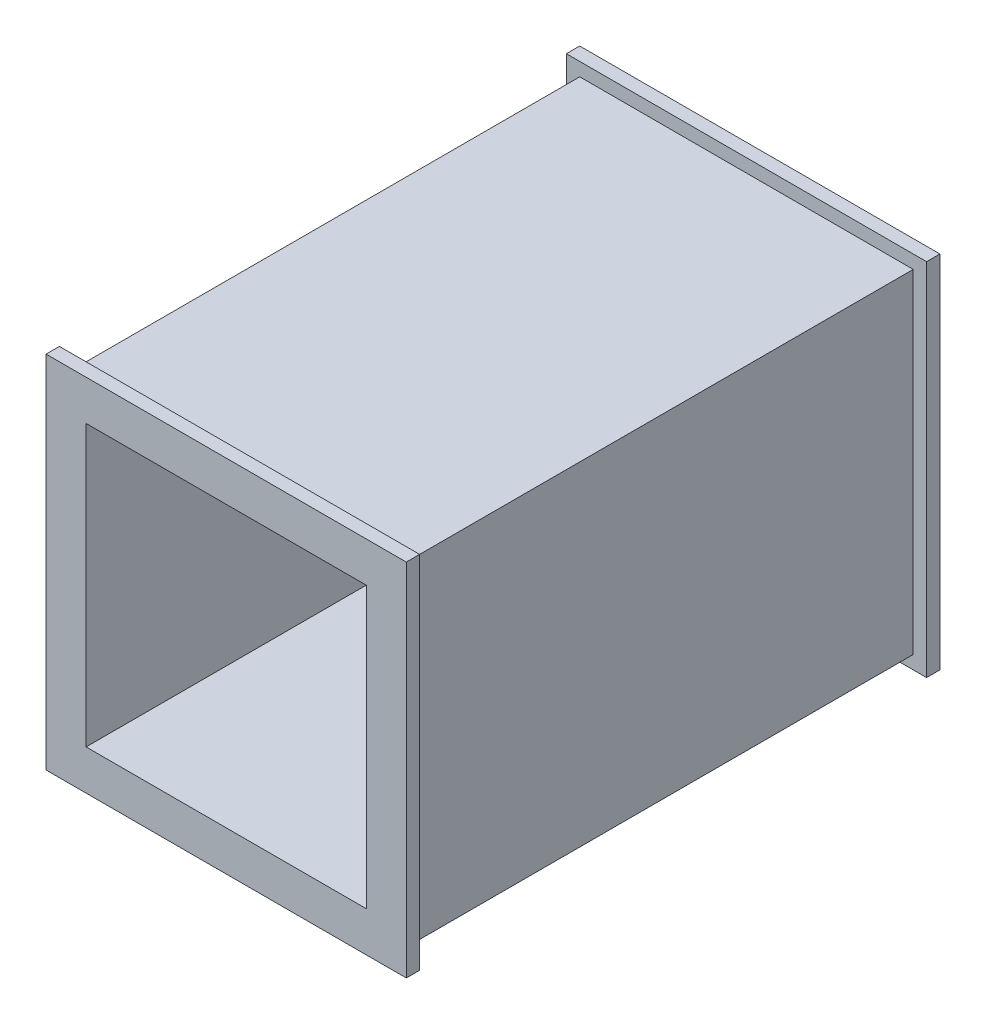
ISO-10303-21;
HEADER;
FILE_DESCRIPTION(('STEP AP214'),'2;1');
FILE_NAME('part.step','',(''),(''),'','','');
FILE_SCHEMA(('AUTOMOTIVE_DESIGN { 1 0 10303 214 1 1 1 1 }'));
ENDSEC;
DATA;
#1=APPLICATION_CONTEXT('core data for automotive mechanical design processes');
#2=APPLICATION_PROTOCOL_DEFINITION('international standard','automotive_design',2000,#1);
#3=PRODUCT_CONTEXT('',#1,'mechanical');
#4=PRODUCT('Part','Part','',(#3));
#5=PRODUCT_RELATED_PRODUCT_CATEGORY('part','',(#4));
#6=PRODUCT_DEFINITION_FORMATION('','',#4);
#7=PRODUCT_DEFINITION_CONTEXT('part definition',#1,'design');
#8=PRODUCT_DEFINITION('design','',#6,#7);
#9=PRODUCT_DEFINITION_SHAPE('','',#8);
#10=(LENGTH_UNIT() NAMED_UNIT(*) SI_UNIT(.MILLI.,.METRE.));
#11=(NAMED_UNIT(*) PLANE_ANGLE_UNIT() SI_UNIT($,.RADIAN.));
#12=(NAMED_UNIT(*) SI_UNIT($,.STERADIAN.) SOLID_ANGLE_UNIT());
#13=UNCERTAINTY_MEASURE_WITH_UNIT(LENGTH_MEASURE(1.E-05),#10,'distance_accuracy_value','');
#14=(GEOMETRIC_REPRESENTATION_CONTEXT(3) GLOBAL_UNCERTAINTY_ASSIGNED_CONTEXT((#13)) GLOBAL_UNIT_ASSIGNED_CONTEXT((#10,
#11,#12)) REPRESENTATION_CONTEXT('',''));
#15=CARTESIAN_POINT('',(0.,0.,0.));
#16=DIRECTION('',(0.,0.,1.));
#17=DIRECTION('',(1.,0.,0.));
#18=AXIS2_PLACEMENT_3D('',#15,#16,#17);
#19=CARTESIAN_POINT('',(62.5,62.5,200.));
#20=DIRECTION('',(-1.,0.,0.));
#21=DIRECTION('',(0.,-1.,0.));
#22=AXIS2_PLACEMENT_3D('',#19,#20,#21);
#23=PLANE('',#22);
#24=DIRECTION('',(0.,-1.,0.));
#25=VECTOR('',#24,1.);
#26=CARTESIAN_POINT('',(62.5,62.5,5.));
#27=LINE('',#26,#25);
#28=CARTESIAN_POINT('',(62.5,62.5,5.));
#29=VERTEX_POINT('',#28);
#30=CARTESIAN_POINT('',(62.5,-62.5,5.));
#31=VERTEX_POINT('',#30);
#32=EDGE_CURVE('E55',#29,#31,#27,.T.);
#33=ORIENTED_EDGE('',*,*,#32,.F.);
#34=DIRECTION('',(0.,0.,-1.));
#35=VECTOR('',#34,1.);
#36=CARTESIAN_POINT('',(62.5,62.5,200.));
#37=LINE('',#36,#35);
#38=CARTESIAN_POINT('',(62.5,62.5,195.));
#39=VERTEX_POINT('',#38);
#40=EDGE_CURVE('E11',#39,#29,#37,.T.);
#41=ORIENTED_EDGE('',*,*,#40,.F.);
#42=DIRECTION('',(0.,1.,0.));
#43=VECTOR('',#42,1.);
#44=CARTESIAN_POINT('',(62.5,62.5,195.));
#45=LINE('',#44,#43);
#46=CARTESIAN_POINT('',(62.5,-62.5,195.));
#47=VERTEX_POINT('',#46);
#48=EDGE_CURVE('E247',#47,#39,#45,.T.);
#49=ORIENTED_EDGE('',*,*,#48,.F.);
#50=DIRECTION('',(0.,0.,-1.));
#51=VECTOR('',#50,1.);
#52=CARTESIAN_POINT('',(62.5,-62.5,200.));
#53=LINE('',#52,#51);
#54=EDGE_CURVE('E253',#47,#31,#53,.T.);
#55=ORIENTED_EDGE('',*,*,#54,.T.);
#56=EDGE_LOOP('',(#33,#41,#49,#55));
#57=FACE_BOUND('',#56,.T.);
#58=ADVANCED_FACE('F41',(#57),#23,.F.);
#59=CARTESIAN_POINT('',(-62.5,62.5,200.));
#60=DIRECTION('',(0.,-1.,0.));
#61=DIRECTION('',(0.,0.,-1.));
#62=AXIS2_PLACEMENT_3D('',#59,#60,#61);
#63=PLANE('',#62);
#64=DIRECTION('',(1.,0.,0.));
#65=VECTOR('',#64,1.);
#66=CARTESIAN_POINT('',(-62.5,62.5,5.));
#67=LINE('',#66,#65);
#68=CARTESIAN_POINT('',(-62.5,62.5,5.));
#69=VERTEX_POINT('',#68);
#70=EDGE_CURVE('E61',#69,#29,#67,.T.);
#71=ORIENTED_EDGE('',*,*,#70,.F.);
#72=DIRECTION('',(0.,0.,-1.));
#73=VECTOR('',#72,1.);
#74=CARTESIAN_POINT('',(-62.5,62.5,200.));
#75=LINE('',#74,#73);
#76=CARTESIAN_POINT('',(-62.5,62.5,195.));
#77=VERTEX_POINT('',#76);
#78=EDGE_CURVE('E48',#77,#69,#75,.T.);
#79=ORIENTED_EDGE('',*,*,#78,.F.);
#80=DIRECTION('',(-1.,0.,0.));
#81=VECTOR('',#80,1.);
#82=CARTESIAN_POINT('',(-62.5,62.5,195.));
#83=LINE('',#82,#81);
#84=EDGE_CURVE('E244',#39,#77,#83,.T.);
#85=ORIENTED_EDGE('',*,*,#84,.F.);
#86=ORIENTED_EDGE('',*,*,#40,.T.);
#87=EDGE_LOOP('',(#71,#79,#85,#86));
#88=FACE_BOUND('',#87,.T.);
#89=ADVANCED_FACE('F291',(#88),#63,.F.);
#90=CARTESIAN_POINT('',(-62.5,62.5,200.));
#91=DIRECTION('',(1.,0.,0.));
#92=DIRECTION('',(0.,1.,0.));
#93=AXIS2_PLACEMENT_3D('',#90,#91,#92);
#94=PLANE('',#93);
#95=DIRECTION('',(0.,1.,0.));
#96=VECTOR('',#95,1.);
#97=CARTESIAN_POINT('',(-62.5,62.5,5.));
#98=LINE('',#97,#96);
#99=CARTESIAN_POINT('',(-62.5,-62.5,5.));
#100=VERTEX_POINT('',#99);
#101=EDGE_CURVE('E201',#100,#69,#98,.T.);
#102=ORIENTED_EDGE('',*,*,#101,.F.);
#103=DIRECTION('',(0.,0.,-1.));
#104=VECTOR('',#103,1.);
#105=CARTESIAN_POINT('',(-62.5,-62.5,200.));
#106=LINE('',#105,#104);
#107=CARTESIAN_POINT('',(-62.5,-62.5,195.));
#108=VERTEX_POINT('',#107);
#109=EDGE_CURVE('E281',#108,#100,#106,.T.);
#110=ORIENTED_EDGE('',*,*,#109,.F.);
#111=DIRECTION('',(0.,-1.,0.));
#112=VECTOR('',#111,1.);
#113=CARTESIAN_POINT('',(-62.5,62.5,195.));
#114=LINE('',#113,#112);
#115=EDGE_CURVE('E241',#77,#108,#114,.T.);
#116=ORIENTED_EDGE('',*,*,#115,.F.);
#117=ORIENTED_EDGE('',*,*,#78,.T.);
#118=EDGE_LOOP('',(#102,#110,#116,#117));
#119=FACE_BOUND('',#118,.T.);
#120=ADVANCED_FACE('F284',(#119),#94,.F.);
#121=CARTESIAN_POINT('',(-62.5,-62.5,200.));
#122=DIRECTION('',(0.,1.,0.));
#123=DIRECTION('',(0.,0.,1.));
#124=AXIS2_PLACEMENT_3D('',#121,#122,#123);
#125=PLANE('',#124);
#126=DIRECTION('',(-1.,0.,0.));
#127=VECTOR('',#126,1.);
#128=CARTESIAN_POINT('',(-62.5,-62.5,5.));
#129=LINE('',#128,#127);
#130=EDGE_CURVE('E195',#31,#100,#129,.T.);
#131=ORIENTED_EDGE('',*,*,#130,.F.);
#132=ORIENTED_EDGE('',*,*,#54,.F.);
#133=DIRECTION('',(1.,0.,0.));
#134=VECTOR('',#133,1.);
#135=CARTESIAN_POINT('',(-62.5,-62.5,195.));
#136=LINE('',#135,#134);
#137=EDGE_CURVE('E233',#108,#47,#136,.T.);
#138=ORIENTED_EDGE('',*,*,#137,.F.);
#139=ORIENTED_EDGE('',*,*,#109,.T.);
#140=EDGE_LOOP('',(#131,#132,#138,#139));
#141=FACE_BOUND('',#140,.T.);
#142=ADVANCED_FACE('F287',(#141),#125,.F.);
#143=CARTESIAN_POINT('',(0.,0.,200.));
#144=DIRECTION('',(0.,0.,1.));
#145=DIRECTION('',(1.,0.,0.));
#146=AXIS2_PLACEMENT_3D('',#143,#144,#145);
#147=PLANE('',#146);
#148=DIRECTION('',(0.,1.,0.));
#149=VECTOR('',#148,1.);
#150=CARTESIAN_POINT('',(52.5,62.5,200.));
#151=LINE('',#150,#149);
#152=CARTESIAN_POINT('',(52.5,-52.5,200.));
#153=VERTEX_POINT('',#152);
#154=CARTESIAN_POINT('',(52.5,52.5,200.));
#155=VERTEX_POINT('',#154);
#156=EDGE_CURVE('E267',#153,#155,#151,.T.);
#157=ORIENTED_EDGE('',*,*,#156,.F.);
#158=DIRECTION('',(1.,0.,0.));
#159=VECTOR('',#158,1.);
#160=CARTESIAN_POINT('',(-62.5,-52.5,200.));
#161=LINE('',#160,#159);
#162=CARTESIAN_POINT('',(-52.5,-52.5,200.));
#163=VERTEX_POINT('',#162);
#164=EDGE_CURVE('E258',#163,#153,#161,.T.);
#165=ORIENTED_EDGE('',*,*,#164,.F.);
#166=DIRECTION('',(0.,-1.,0.));
#167=VECTOR('',#166,1.);
#168=CARTESIAN_POINT('',(-52.5,62.5,200.));
#169=LINE('',#168,#167);
#170=CARTESIAN_POINT('',(-52.5,52.5,200.));
#171=VERTEX_POINT('',#170);
#172=EDGE_CURVE('E276',#171,#163,#169,.T.);
#173=ORIENTED_EDGE('',*,*,#172,.F.);
#174=DIRECTION('',(-1.,0.,0.));
#175=VECTOR('',#174,1.);
#176=CARTESIAN_POINT('',(-62.5,52.5,200.));
#177=LINE('',#176,#175);
#178=EDGE_CURVE('E274',#155,#171,#177,.T.);
#179=ORIENTED_EDGE('',*,*,#178,.F.);
#180=EDGE_LOOP('',(#157,#165,#173,#179));
#181=FACE_BOUND('',#180,.T.);
#182=DIRECTION('',(1.,0.,0.));
#183=VECTOR('',#182,1.);
#184=CARTESIAN_POINT('',(0.,-67.5,200.));
#185=LINE('',#184,#183);
#186=CARTESIAN_POINT('',(-67.5,-67.5,200.));
#187=VERTEX_POINT('',#186);
#188=CARTESIAN_POINT('',(67.5,-67.5,200.));
#189=VERTEX_POINT('',#188);
#190=EDGE_CURVE('E206',#187,#189,#185,.T.);
#191=ORIENTED_EDGE('',*,*,#190,.T.);
#192=DIRECTION('',(0.,1.,0.));
#193=VECTOR('',#192,1.);
#194=CARTESIAN_POINT('',(67.5,0.,200.));
#195=LINE('',#194,#193);
#196=CARTESIAN_POINT('',(67.5,67.5,200.));
#197=VERTEX_POINT('',#196);
#198=EDGE_CURVE('E223',#189,#197,#195,.T.);
#199=ORIENTED_EDGE('',*,*,#198,.T.);
#200=DIRECTION('',(-1.,0.,0.));
#201=VECTOR('',#200,1.);
#202=CARTESIAN_POINT('',(0.,67.5,200.));
#203=LINE('',#202,#201);
#204=CARTESIAN_POINT('',(-67.5,67.5,200.));
#205=VERTEX_POINT('',#204);
#206=EDGE_CURVE('E226',#197,#205,#203,.T.);
#207=ORIENTED_EDGE('',*,*,#206,.T.);
#208=DIRECTION('',(0.,-1.,0.));
#209=VECTOR('',#208,1.);
#210=CARTESIAN_POINT('',(-67.5,0.,200.));
#211=LINE('',#210,#209);
#212=EDGE_CURVE('E211',#205,#187,#211,.T.);
#213=ORIENTED_EDGE('',*,*,#212,.T.);
#214=EDGE_LOOP('',(#191,#199,#207,#213));
#215=FACE_BOUND('',#214,.T.);
#216=ADVANCED_FACE('F301',(#181,#215),#147,.T.);
#217=CARTESIAN_POINT('',(0.,0.,0.));
#218=DIRECTION('',(0.,0.,1.));
#219=DIRECTION('',(1.,0.,0.));
#220=AXIS2_PLACEMENT_3D('',#217,#218,#219);
#221=PLANE('',#220);
#222=DIRECTION('',(1.,0.,0.));
#223=VECTOR('',#222,1.);
#224=CARTESIAN_POINT('',(-62.5,-52.5,0.));
#225=LINE('',#224,#223);
#226=CARTESIAN_POINT('',(-52.5,-52.5,0.));
#227=VERTEX_POINT('',#226);
#228=CARTESIAN_POINT('',(52.5,-52.5,0.));
#229=VERTEX_POINT('',#228);
#230=EDGE_CURVE('E264',#227,#229,#225,.T.);
#231=ORIENTED_EDGE('',*,*,#230,.T.);
#232=DIRECTION('',(0.,1.,0.));
#233=VECTOR('',#232,1.);
#234=CARTESIAN_POINT('',(52.5,62.5,0.));
#235=LINE('',#234,#233);
#236=CARTESIAN_POINT('',(52.5,52.5,0.));
#237=VERTEX_POINT('',#236);
#238=EDGE_CURVE('E250',#229,#237,#235,.T.);
#239=ORIENTED_EDGE('',*,*,#238,.T.);
#240=DIRECTION('',(-1.,0.,0.));
#241=VECTOR('',#240,1.);
#242=CARTESIAN_POINT('',(-62.5,52.5,0.));
#243=LINE('',#242,#241);
#244=CARTESIAN_POINT('',(-52.5,52.5,0.));
#245=VERTEX_POINT('',#244);
#246=EDGE_CURVE('E263',#237,#245,#243,.T.);
#247=ORIENTED_EDGE('',*,*,#246,.T.);
#248=DIRECTION('',(0.,-1.,0.));
#249=VECTOR('',#248,1.);
#250=CARTESIAN_POINT('',(-52.5,62.5,0.));
#251=LINE('',#250,#249);
#252=EDGE_CURVE('E268',#245,#227,#251,.T.);
#253=ORIENTED_EDGE('',*,*,#252,.T.);
#254=EDGE_LOOP('',(#231,#239,#247,#253));
#255=FACE_BOUND('',#254,.T.);
#256=DIRECTION('',(-1.,0.,0.));
#257=VECTOR('',#256,1.);
#258=CARTESIAN_POINT('',(0.,-67.5,0.));
#259=LINE('',#258,#257);
#260=CARTESIAN_POINT('',(67.5,-67.5,0.));
#261=VERTEX_POINT('',#260);
#262=CARTESIAN_POINT('',(-67.5,-67.5,0.));
#263=VERTEX_POINT('',#262);
#264=EDGE_CURVE('E189',#261,#263,#259,.T.);
#265=ORIENTED_EDGE('',*,*,#264,.T.);
#266=DIRECTION('',(0.,1.,0.));
#267=VECTOR('',#266,1.);
#268=CARTESIAN_POINT('',(-67.5,0.,0.));
#269=LINE('',#268,#267);
#270=CARTESIAN_POINT('',(-67.5,67.5,0.));
#271=VERTEX_POINT('',#270);
#272=EDGE_CURVE('E160',#263,#271,#269,.T.);
#273=ORIENTED_EDGE('',*,*,#272,.T.);
#274=DIRECTION('',(1.,0.,0.));
#275=VECTOR('',#274,1.);
#276=CARTESIAN_POINT('',(0.,67.5,0.));
#277=LINE('',#276,#275);
#278=CARTESIAN_POINT('',(67.5,67.5,0.));
#279=VERTEX_POINT('',#278);
#280=EDGE_CURVE('E184',#271,#279,#277,.T.);
#281=ORIENTED_EDGE('',*,*,#280,.T.);
#282=DIRECTION('',(0.,-1.,0.));
#283=VECTOR('',#282,1.);
#284=CARTESIAN_POINT('',(67.5,0.,0.));
#285=LINE('',#284,#283);
#286=EDGE_CURVE('E181',#279,#261,#285,.T.);
#287=ORIENTED_EDGE('',*,*,#286,.T.);
#288=EDGE_LOOP('',(#265,#273,#281,#287));
#289=FACE_BOUND('',#288,.T.);
#290=ADVANCED_FACE('F302',(#255,#289),#221,.F.);
#291=CARTESIAN_POINT('',(52.5,62.5,200.));
#292=DIRECTION('',(-1.,0.,0.));
#293=DIRECTION('',(0.,-1.,0.));
#294=AXIS2_PLACEMENT_3D('',#291,#292,#293);
#295=PLANE('',#294);
#296=ORIENTED_EDGE('',*,*,#238,.F.);
#297=DIRECTION('',(0.,0.,-1.));
#298=VECTOR('',#297,1.);
#299=CARTESIAN_POINT('',(52.5,-52.5,200.));
#300=LINE('',#299,#298);
#301=EDGE_CURVE('E255',#153,#229,#300,.T.);
#302=ORIENTED_EDGE('',*,*,#301,.F.);
#303=ORIENTED_EDGE('',*,*,#156,.T.);
#304=DIRECTION('',(0.,0.,-1.));
#305=VECTOR('',#304,1.);
#306=CARTESIAN_POINT('',(52.5,52.5,200.));
#307=LINE('',#306,#305);
#308=EDGE_CURVE('E251',#155,#237,#307,.T.);
#309=ORIENTED_EDGE('',*,*,#308,.T.);
#310=EDGE_LOOP('',(#296,#302,#303,#309));
#311=FACE_BOUND('',#310,.T.);
#312=ADVANCED_FACE('F305',(#311),#295,.T.);
#313=CARTESIAN_POINT('',(-62.5,52.5,200.));
#314=DIRECTION('',(0.,-1.,0.));
#315=DIRECTION('',(0.,0.,-1.));
#316=AXIS2_PLACEMENT_3D('',#313,#314,#315);
#317=PLANE('',#316);
#318=ORIENTED_EDGE('',*,*,#246,.F.);
#319=ORIENTED_EDGE('',*,*,#308,.F.);
#320=ORIENTED_EDGE('',*,*,#178,.T.);
#321=DIRECTION('',(0.,0.,-1.));
#322=VECTOR('',#321,1.);
#323=CARTESIAN_POINT('',(-52.5,52.5,200.));
#324=LINE('',#323,#322);
#325=EDGE_CURVE('E254',#171,#245,#324,.T.);
#326=ORIENTED_EDGE('',*,*,#325,.T.);
#327=EDGE_LOOP('',(#318,#319,#320,#326));
#328=FACE_BOUND('',#327,.T.);
#329=ADVANCED_FACE('F317',(#328),#317,.T.);
#330=CARTESIAN_POINT('',(-52.5,62.5,200.));
#331=DIRECTION('',(1.,0.,0.));
#332=DIRECTION('',(0.,1.,0.));
#333=AXIS2_PLACEMENT_3D('',#330,#331,#332);
#334=PLANE('',#333);
#335=ORIENTED_EDGE('',*,*,#252,.F.);
#336=ORIENTED_EDGE('',*,*,#325,.F.);
#337=ORIENTED_EDGE('',*,*,#172,.T.);
#338=DIRECTION('',(0.,0.,-1.));
#339=VECTOR('',#338,1.);
#340=CARTESIAN_POINT('',(-52.5,-52.5,200.));
#341=LINE('',#340,#339);
#342=EDGE_CURVE('E257',#163,#227,#341,.T.);
#343=ORIENTED_EDGE('',*,*,#342,.T.);
#344=EDGE_LOOP('',(#335,#336,#337,#343));
#345=FACE_BOUND('',#344,.T.);
#346=ADVANCED_FACE('F313',(#345),#334,.T.);
#347=CARTESIAN_POINT('',(-62.5,-52.5,200.));
#348=DIRECTION('',(0.,1.,0.));
#349=DIRECTION('',(0.,0.,1.));
#350=AXIS2_PLACEMENT_3D('',#347,#348,#349);
#351=PLANE('',#350);
#352=ORIENTED_EDGE('',*,*,#230,.F.);
#353=ORIENTED_EDGE('',*,*,#342,.F.);
#354=ORIENTED_EDGE('',*,*,#164,.T.);
#355=ORIENTED_EDGE('',*,*,#301,.T.);
#356=EDGE_LOOP('',(#352,#353,#354,#355));
#357=FACE_BOUND('',#356,.T.);
#358=ADVANCED_FACE('F310',(#357),#351,.T.);
#359=CARTESIAN_POINT('',(0.,0.,195.));
#360=DIRECTION('',(0.,0.,1.));
#361=DIRECTION('',(1.,0.,0.));
#362=AXIS2_PLACEMENT_3D('',#359,#360,#361);
#363=PLANE('',#362);
#364=DIRECTION('',(1.,0.,0.));
#365=VECTOR('',#364,1.);
#366=CARTESIAN_POINT('',(0.,-67.5,195.));
#367=LINE('',#366,#365);
#368=CARTESIAN_POINT('',(-67.5,-67.5,195.));
#369=VERTEX_POINT('',#368);
#370=CARTESIAN_POINT('',(67.5,-67.5,195.));
#371=VERTEX_POINT('',#370);
#372=EDGE_CURVE('E207',#369,#371,#367,.T.);
#373=ORIENTED_EDGE('',*,*,#372,.F.);
#374=DIRECTION('',(0.,-1.,0.));
#375=VECTOR('',#374,1.);
#376=CARTESIAN_POINT('',(-67.5,0.,195.));
#377=LINE('',#376,#375);
#378=CARTESIAN_POINT('',(-67.5,67.5,195.));
#379=VERTEX_POINT('',#378);
#380=EDGE_CURVE('E217',#379,#369,#377,.T.);
#381=ORIENTED_EDGE('',*,*,#380,.F.);
#382=DIRECTION('',(-1.,0.,0.));
#383=VECTOR('',#382,1.);
#384=CARTESIAN_POINT('',(0.,67.5,195.));
#385=LINE('',#384,#383);
#386=CARTESIAN_POINT('',(67.5,67.5,195.));
#387=VERTEX_POINT('',#386);
#388=EDGE_CURVE('E214',#387,#379,#385,.T.);
#389=ORIENTED_EDGE('',*,*,#388,.F.);
#390=DIRECTION('',(0.,1.,0.));
#391=VECTOR('',#390,1.);
#392=CARTESIAN_POINT('',(67.5,0.,195.));
#393=LINE('',#392,#391);
#394=EDGE_CURVE('E210',#371,#387,#393,.T.);
#395=ORIENTED_EDGE('',*,*,#394,.F.);
#396=EDGE_LOOP('',(#373,#381,#389,#395));
#397=FACE_BOUND('',#396,.T.);
#398=ORIENTED_EDGE('',*,*,#137,.T.);
#399=ORIENTED_EDGE('',*,*,#48,.T.);
#400=ORIENTED_EDGE('',*,*,#84,.T.);
#401=ORIENTED_EDGE('',*,*,#115,.T.);
#402=EDGE_LOOP('',(#398,#399,#400,#401));
#403=FACE_BOUND('',#402,.T.);
#404=ADVANCED_FACE('F290',(#397,#403),#363,.F.);
#405=CARTESIAN_POINT('',(0.,-67.5,195.));
#406=DIRECTION('',(0.,-1.,0.));
#407=DIRECTION('',(0.,0.,-1.));
#408=AXIS2_PLACEMENT_3D('',#405,#406,#407);
#409=PLANE('',#408);
#410=ORIENTED_EDGE('',*,*,#190,.F.);
#411=DIRECTION('',(0.,0.,1.));
#412=VECTOR('',#411,1.);
#413=CARTESIAN_POINT('',(-67.5,-67.5,195.));
#414=LINE('',#413,#412);
#415=EDGE_CURVE('E231',#369,#187,#414,.T.);
#416=ORIENTED_EDGE('',*,*,#415,.F.);
#417=ORIENTED_EDGE('',*,*,#372,.T.);
#418=DIRECTION('',(0.,0.,1.));
#419=VECTOR('',#418,1.);
#420=CARTESIAN_POINT('',(67.5,-67.5,195.));
#421=LINE('',#420,#419);
#422=EDGE_CURVE('E220',#371,#189,#421,.T.);
#423=ORIENTED_EDGE('',*,*,#422,.T.);
#424=EDGE_LOOP('',(#410,#416,#417,#423));
#425=FACE_BOUND('',#424,.T.);
#426=ADVANCED_FACE('F325',(#425),#409,.T.);
#427=CARTESIAN_POINT('',(-67.5,0.,195.));
#428=DIRECTION('',(-1.,0.,0.));
#429=DIRECTION('',(0.,0.,1.));
#430=AXIS2_PLACEMENT_3D('',#427,#428,#429);
#431=PLANE('',#430);
#432=ORIENTED_EDGE('',*,*,#212,.F.);
#433=DIRECTION('',(0.,0.,1.));
#434=VECTOR('',#433,1.);
#435=CARTESIAN_POINT('',(-67.5,67.5,195.));
#436=LINE('',#435,#434);
#437=EDGE_CURVE('E234',#379,#205,#436,.T.);
#438=ORIENTED_EDGE('',*,*,#437,.F.);
#439=ORIENTED_EDGE('',*,*,#380,.T.);
#440=ORIENTED_EDGE('',*,*,#415,.T.);
#441=EDGE_LOOP('',(#432,#438,#439,#440));
#442=FACE_BOUND('',#441,.T.);
#443=ADVANCED_FACE('F328',(#442),#431,.T.);
#444=CARTESIAN_POINT('',(0.,67.5,195.));
#445=DIRECTION('',(0.,1.,0.));
#446=DIRECTION('',(0.,0.,1.));
#447=AXIS2_PLACEMENT_3D('',#444,#445,#446);
#448=PLANE('',#447);
#449=ORIENTED_EDGE('',*,*,#206,.F.);
#450=DIRECTION('',(0.,0.,1.));
#451=VECTOR('',#450,1.);
#452=CARTESIAN_POINT('',(67.5,67.5,195.));
#453=LINE('',#452,#451);
#454=EDGE_CURVE('E236',#387,#197,#453,.T.);
#455=ORIENTED_EDGE('',*,*,#454,.F.);
#456=ORIENTED_EDGE('',*,*,#388,.T.);
#457=ORIENTED_EDGE('',*,*,#437,.T.);
#458=EDGE_LOOP('',(#449,#455,#456,#457));
#459=FACE_BOUND('',#458,.T.);
#460=ADVANCED_FACE('F333',(#459),#448,.T.);
#461=CARTESIAN_POINT('',(67.5,0.,195.));
#462=DIRECTION('',(1.,0.,0.));
#463=DIRECTION('',(0.,0.,-1.));
#464=AXIS2_PLACEMENT_3D('',#461,#462,#463);
#465=PLANE('',#464);
#466=ORIENTED_EDGE('',*,*,#198,.F.);
#467=ORIENTED_EDGE('',*,*,#422,.F.);
#468=ORIENTED_EDGE('',*,*,#394,.T.);
#469=ORIENTED_EDGE('',*,*,#454,.T.);
#470=EDGE_LOOP('',(#466,#467,#468,#469));
#471=FACE_BOUND('',#470,.T.);
#472=ADVANCED_FACE('F330',(#471),#465,.T.);
#473=CARTESIAN_POINT('',(0.,0.,5.));
#474=DIRECTION('',(0.,0.,-1.));
#475=DIRECTION('',(-1.,0.,0.));
#476=AXIS2_PLACEMENT_3D('',#473,#474,#475);
#477=PLANE('',#476);
#478=DIRECTION('',(-1.,0.,0.));
#479=VECTOR('',#478,1.);
#480=CARTESIAN_POINT('',(0.,-67.5,5.));
#481=LINE('',#480,#479);
#482=CARTESIAN_POINT('',(67.5,-67.5,5.));
#483=VERTEX_POINT('',#482);
#484=CARTESIAN_POINT('',(-67.5,-67.5,5.));
#485=VERTEX_POINT('',#484);
#486=EDGE_CURVE('E174',#483,#485,#481,.T.);
#487=ORIENTED_EDGE('',*,*,#486,.F.);
#488=DIRECTION('',(0.,-1.,0.));
#489=VECTOR('',#488,1.);
#490=CARTESIAN_POINT('',(67.5,0.,5.));
#491=LINE('',#490,#489);
#492=CARTESIAN_POINT('',(67.5,67.5,5.));
#493=VERTEX_POINT('',#492);
#494=EDGE_CURVE('E166',#493,#483,#491,.T.);
#495=ORIENTED_EDGE('',*,*,#494,.F.);
#496=DIRECTION('',(1.,0.,0.));
#497=VECTOR('',#496,1.);
#498=CARTESIAN_POINT('',(0.,67.5,5.));
#499=LINE('',#498,#497);
#500=CARTESIAN_POINT('',(-67.5,67.5,5.));
#501=VERTEX_POINT('',#500);
#502=EDGE_CURVE('E177',#501,#493,#499,.T.);
#503=ORIENTED_EDGE('',*,*,#502,.F.);
#504=DIRECTION('',(0.,1.,0.));
#505=VECTOR('',#504,1.);
#506=CARTESIAN_POINT('',(-67.5,0.,5.));
#507=LINE('',#506,#505);
#508=EDGE_CURVE('E158',#485,#501,#507,.T.);
#509=ORIENTED_EDGE('',*,*,#508,.F.);
#510=EDGE_LOOP('',(#487,#495,#503,#509));
#511=FACE_BOUND('',#510,.T.);
#512=ORIENTED_EDGE('',*,*,#70,.T.);
#513=ORIENTED_EDGE('',*,*,#32,.T.);
#514=ORIENTED_EDGE('',*,*,#130,.T.);
#515=ORIENTED_EDGE('',*,*,#101,.T.);
#516=EDGE_LOOP('',(#512,#513,#514,#515));
#517=FACE_BOUND('',#516,.T.);
#518=ADVANCED_FACE('F171',(#511,#517),#477,.F.);
#519=CARTESIAN_POINT('',(0.,-67.5,5.));
#520=DIRECTION('',(0.,-1.,0.));
#521=DIRECTION('',(0.,0.,-1.));
#522=AXIS2_PLACEMENT_3D('',#519,#520,#521);
#523=PLANE('',#522);
#524=ORIENTED_EDGE('',*,*,#264,.F.);
#525=DIRECTION('',(0.,0.,-1.));
#526=VECTOR('',#525,1.);
#527=CARTESIAN_POINT('',(67.5,-67.5,5.));
#528=LINE('',#527,#526);
#529=EDGE_CURVE('E180',#483,#261,#528,.T.);
#530=ORIENTED_EDGE('',*,*,#529,.F.);
#531=ORIENTED_EDGE('',*,*,#486,.T.);
#532=DIRECTION('',(0.,0.,-1.));
#533=VECTOR('',#532,1.);
#534=CARTESIAN_POINT('',(-67.5,-67.5,5.));
#535=LINE('',#534,#533);
#536=EDGE_CURVE('E155',#485,#263,#535,.T.);
#537=ORIENTED_EDGE('',*,*,#536,.T.);
#538=EDGE_LOOP('',(#524,#530,#531,#537));
#539=FACE_BOUND('',#538,.T.);
#540=ADVANCED_FACE('F179',(#539),#523,.T.);
#541=CARTESIAN_POINT('',(67.5,0.,5.));
#542=DIRECTION('',(1.,0.,0.));
#543=DIRECTION('',(0.,0.,-1.));
#544=AXIS2_PLACEMENT_3D('',#541,#542,#543);
#545=PLANE('',#544);
#546=ORIENTED_EDGE('',*,*,#286,.F.);
#547=DIRECTION('',(0.,0.,-1.));
#548=VECTOR('',#547,1.);
#549=CARTESIAN_POINT('',(67.5,67.5,5.));
#550=LINE('',#549,#548);
#551=EDGE_CURVE('E196',#493,#279,#550,.T.);
#552=ORIENTED_EDGE('',*,*,#551,.F.);
#553=ORIENTED_EDGE('',*,*,#494,.T.);
#554=ORIENTED_EDGE('',*,*,#529,.T.);
#555=EDGE_LOOP('',(#546,#552,#553,#554));
#556=FACE_BOUND('',#555,.T.);
#557=ADVANCED_FACE('F346',(#556),#545,.T.);
#558=CARTESIAN_POINT('',(0.,67.5,5.));
#559=DIRECTION('',(0.,1.,0.));
#560=DIRECTION('',(0.,0.,1.));
#561=AXIS2_PLACEMENT_3D('',#558,#559,#560);
#562=PLANE('',#561);
#563=ORIENTED_EDGE('',*,*,#280,.F.);
#564=DIRECTION('',(0.,0.,-1.));
#565=VECTOR('',#564,1.);
#566=CARTESIAN_POINT('',(-67.5,67.5,5.));
#567=LINE('',#566,#565);
#568=EDGE_CURVE('E165',#501,#271,#567,.T.);
#569=ORIENTED_EDGE('',*,*,#568,.F.);
#570=ORIENTED_EDGE('',*,*,#502,.T.);
#571=ORIENTED_EDGE('',*,*,#551,.T.);
#572=EDGE_LOOP('',(#563,#569,#570,#571));
#573=FACE_BOUND('',#572,.T.);
#574=ADVANCED_FACE('F349',(#573),#562,.T.);
#575=CARTESIAN_POINT('',(-67.5,0.,5.));
#576=DIRECTION('',(-1.,0.,0.));
#577=DIRECTION('',(0.,0.,1.));
#578=AXIS2_PLACEMENT_3D('',#575,#576,#577);
#579=PLANE('',#578);
#580=ORIENTED_EDGE('',*,*,#272,.F.);
#581=ORIENTED_EDGE('',*,*,#536,.F.);
#582=ORIENTED_EDGE('',*,*,#508,.T.);
#583=ORIENTED_EDGE('',*,*,#568,.T.);
#584=EDGE_LOOP('',(#580,#581,#582,#583));
#585=FACE_BOUND('',#584,.T.);
#586=ADVANCED_FACE('F157',(#585),#579,.T.);
#587=CLOSED_SHELL('',(#58,#89,#120,#142,#216,#290,#312,#329,#346,#358,#404,#426,#443,#460,#472,
#518,#540,#557,#574,#586));
#588=MANIFOLD_SOLID_BREP('B2',#587);
#589=ADVANCED_BREP_SHAPE_REPRESENTATION('',(#18,#588),#14);
#590=SHAPE_DEFINITION_REPRESENTATION(#9,#589);
ENDSEC;
END-ISO-10303-21;
